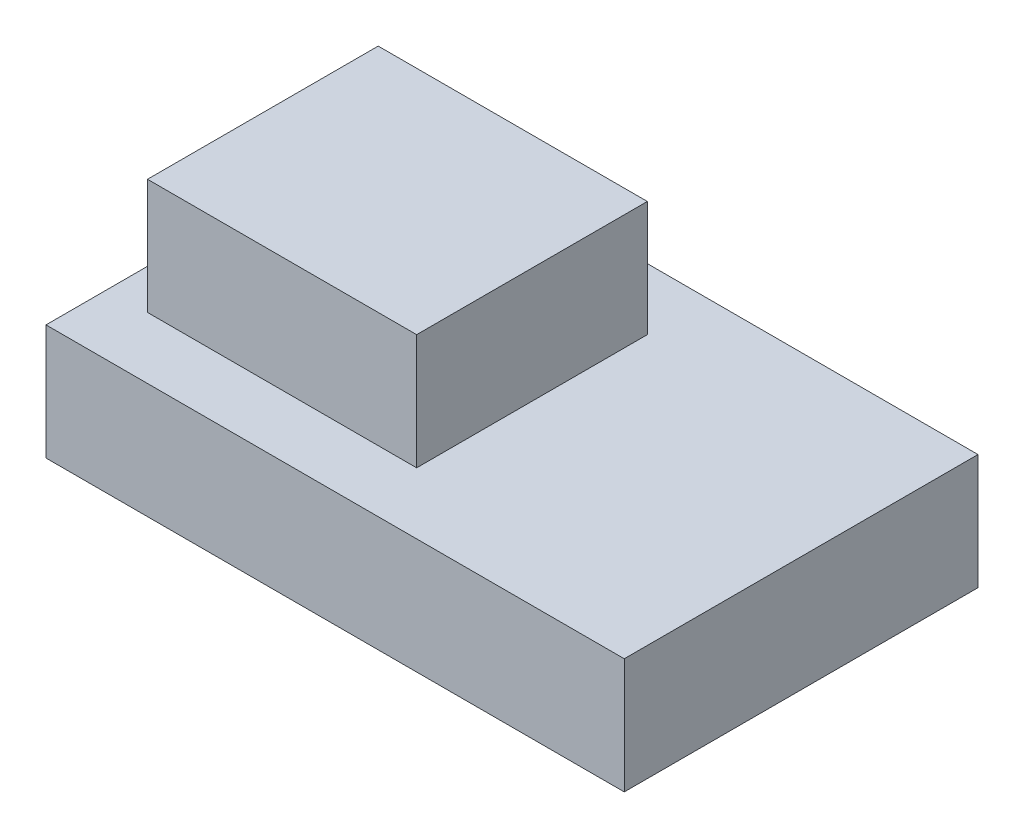
ISO-10303-21;
HEADER;
FILE_DESCRIPTION(('STEP AP214'),'2;1');
FILE_NAME('part.step','',(''),(''),'','','');
FILE_SCHEMA(('AUTOMOTIVE_DESIGN { 1 0 10303 214 1 1 1 1 }'));
ENDSEC;
DATA;
#1=APPLICATION_CONTEXT('core data for automotive mechanical design processes');
#2=APPLICATION_PROTOCOL_DEFINITION('international standard','automotive_design',2000,#1);
#3=PRODUCT_CONTEXT('',#1,'mechanical');
#4=PRODUCT('Part','Part','',(#3));
#5=PRODUCT_RELATED_PRODUCT_CATEGORY('part','',(#4));
#6=PRODUCT_DEFINITION_FORMATION('','',#4);
#7=PRODUCT_DEFINITION_CONTEXT('part definition',#1,'design');
#8=PRODUCT_DEFINITION('design','',#6,#7);
#9=PRODUCT_DEFINITION_SHAPE('','',#8);
#10=(LENGTH_UNIT() NAMED_UNIT(*) SI_UNIT(.MILLI.,.METRE.));
#11=(NAMED_UNIT(*) PLANE_ANGLE_UNIT() SI_UNIT($,.RADIAN.));
#12=(NAMED_UNIT(*) SI_UNIT($,.STERADIAN.) SOLID_ANGLE_UNIT());
#13=UNCERTAINTY_MEASURE_WITH_UNIT(LENGTH_MEASURE(1.E-05),#10,'distance_accuracy_value','');
#14=(GEOMETRIC_REPRESENTATION_CONTEXT(3) GLOBAL_UNCERTAINTY_ASSIGNED_CONTEXT((#13)) GLOBAL_UNIT_ASSIGNED_CONTEXT((#10,
#11,#12)) REPRESENTATION_CONTEXT('',''));
#15=CARTESIAN_POINT('',(0.,0.,0.));
#16=DIRECTION('',(0.,0.,1.));
#17=DIRECTION('',(1.,0.,0.));
#18=AXIS2_PLACEMENT_3D('',#15,#16,#17);
#19=CARTESIAN_POINT('',(0.,19.05,0.));
#20=DIRECTION('',(0.,-1.,0.));
#21=DIRECTION('',(0.,0.,-1.));
#22=AXIS2_PLACEMENT_3D('',#19,#20,#21);
#23=PLANE('',#22);
#24=DIRECTION('',(0.,0.,-1.));
#25=VECTOR('',#24,1.);
#26=CARTESIAN_POINT('',(47.752,19.05,29.21));
#27=LINE('',#26,#25);
#28=CARTESIAN_POINT('',(47.752,19.05,29.21));
#29=VERTEX_POINT('',#28);
#30=CARTESIAN_POINT('',(47.752,19.05,-29.21));
#31=VERTEX_POINT('',#30);
#32=EDGE_CURVE('E128',#29,#31,#27,.T.);
#33=ORIENTED_EDGE('',*,*,#32,.T.);
#34=DIRECTION('',(-1.,0.,0.));
#35=VECTOR('',#34,1.);
#36=CARTESIAN_POINT('',(-47.752,19.05,-29.21));
#37=LINE('',#36,#35);
#38=CARTESIAN_POINT('',(-47.752,19.05,-29.21));
#39=VERTEX_POINT('',#38);
#40=EDGE_CURVE('E131',#31,#39,#37,.T.);
#41=ORIENTED_EDGE('',*,*,#40,.T.);
#42=DIRECTION('',(0.,0.,1.));
#43=VECTOR('',#42,1.);
#44=CARTESIAN_POINT('',(-47.752,19.05,29.21));
#45=LINE('',#44,#43);
#46=CARTESIAN_POINT('',(-47.752,19.05,29.21));
#47=VERTEX_POINT('',#46);
#48=EDGE_CURVE('E134',#39,#47,#45,.T.);
#49=ORIENTED_EDGE('',*,*,#48,.T.);
#50=DIRECTION('',(1.,0.,0.));
#51=VECTOR('',#50,1.);
#52=CARTESIAN_POINT('',(-47.752,19.05,29.21));
#53=LINE('',#52,#51);
#54=EDGE_CURVE('E136',#47,#29,#53,.T.);
#55=ORIENTED_EDGE('',*,*,#54,.T.);
#56=EDGE_LOOP('',(#33,#41,#49,#55));
#57=FACE_BOUND('',#56,.T.);
#58=DIRECTION('',(0.,0.,-1.));
#59=VECTOR('',#58,1.);
#60=CARTESIAN_POINT('',(3.30200000000002,19.05,19.05));
#61=LINE('',#60,#59);
#62=CARTESIAN_POINT('',(3.30200000000002,19.05,19.05));
#63=VERTEX_POINT('',#62);
#64=CARTESIAN_POINT('',(3.30200000000002,19.05,-19.05));
#65=VERTEX_POINT('',#64);
#66=EDGE_CURVE('E118',#63,#65,#61,.T.);
#67=ORIENTED_EDGE('',*,*,#66,.F.);
#68=DIRECTION('',(1.,0.,0.));
#69=VECTOR('',#68,1.);
#70=CARTESIAN_POINT('',(-41.148,19.05,19.05));
#71=LINE('',#70,#69);
#72=CARTESIAN_POINT('',(-41.148,19.05,19.05));
#73=VERTEX_POINT('',#72);
#74=EDGE_CURVE('E115',#73,#63,#71,.T.);
#75=ORIENTED_EDGE('',*,*,#74,.F.);
#76=DIRECTION('',(0.,0.,1.));
#77=VECTOR('',#76,1.);
#78=CARTESIAN_POINT('',(-41.148,19.05,19.05));
#79=LINE('',#78,#77);
#80=CARTESIAN_POINT('',(-41.148,19.05,-19.05));
#81=VERTEX_POINT('',#80);
#82=EDGE_CURVE('E53',#81,#73,#79,.T.);
#83=ORIENTED_EDGE('',*,*,#82,.F.);
#84=DIRECTION('',(-1.,0.,0.));
#85=VECTOR('',#84,1.);
#86=CARTESIAN_POINT('',(-41.148,19.05,-19.05));
#87=LINE('',#86,#85);
#88=EDGE_CURVE('E48',#65,#81,#87,.T.);
#89=ORIENTED_EDGE('',*,*,#88,.F.);
#90=EDGE_LOOP('',(#67,#75,#83,#89));
#91=FACE_BOUND('',#90,.T.);
#92=ADVANCED_FACE('F33',(#57,#91),#23,.F.);
#93=CARTESIAN_POINT('',(47.752,19.05,29.21));
#94=DIRECTION('',(-1.,0.,0.));
#95=DIRECTION('',(0.,0.,1.));
#96=AXIS2_PLACEMENT_3D('',#93,#94,#95);
#97=PLANE('',#96);
#98=DIRECTION('',(0.,0.,-1.));
#99=VECTOR('',#98,1.);
#100=CARTESIAN_POINT('',(47.752,0.,29.21));
#101=LINE('',#100,#99);
#102=CARTESIAN_POINT('',(47.752,0.,29.21));
#103=VERTEX_POINT('',#102);
#104=CARTESIAN_POINT('',(47.752,0.,-29.21));
#105=VERTEX_POINT('',#104);
#106=EDGE_CURVE('E119',#103,#105,#101,.T.);
#107=ORIENTED_EDGE('',*,*,#106,.T.);
#108=DIRECTION('',(0.,-1.,0.));
#109=VECTOR('',#108,1.);
#110=CARTESIAN_POINT('',(47.752,19.05,-29.21));
#111=LINE('',#110,#109);
#112=EDGE_CURVE('E11',#31,#105,#111,.T.);
#113=ORIENTED_EDGE('',*,*,#112,.F.);
#114=ORIENTED_EDGE('',*,*,#32,.F.);
#115=DIRECTION('',(0.,-1.,0.));
#116=VECTOR('',#115,1.);
#117=CARTESIAN_POINT('',(47.752,19.05,29.21));
#118=LINE('',#117,#116);
#119=EDGE_CURVE('E137',#29,#103,#118,.T.);
#120=ORIENTED_EDGE('',*,*,#119,.T.);
#121=EDGE_LOOP('',(#107,#113,#114,#120));
#122=FACE_BOUND('',#121,.T.);
#123=ADVANCED_FACE('F35',(#122),#97,.F.);
#124=CARTESIAN_POINT('',(-47.752,19.05,-29.21));
#125=DIRECTION('',(0.,0.,1.));
#126=DIRECTION('',(1.,0.,0.));
#127=AXIS2_PLACEMENT_3D('',#124,#125,#126);
#128=PLANE('',#127);
#129=DIRECTION('',(-1.,0.,0.));
#130=VECTOR('',#129,1.);
#131=CARTESIAN_POINT('',(-47.752,0.,-29.21));
#132=LINE('',#131,#130);
#133=CARTESIAN_POINT('',(-47.752,0.,-29.21));
#134=VERTEX_POINT('',#133);
#135=EDGE_CURVE('E122',#105,#134,#132,.T.);
#136=ORIENTED_EDGE('',*,*,#135,.T.);
#137=DIRECTION('',(0.,-1.,0.));
#138=VECTOR('',#137,1.);
#139=CARTESIAN_POINT('',(-47.752,19.05,-29.21));
#140=LINE('',#139,#138);
#141=EDGE_CURVE('E41',#39,#134,#140,.T.);
#142=ORIENTED_EDGE('',*,*,#141,.F.);
#143=ORIENTED_EDGE('',*,*,#40,.F.);
#144=ORIENTED_EDGE('',*,*,#112,.T.);
#145=EDGE_LOOP('',(#136,#142,#143,#144));
#146=FACE_BOUND('',#145,.T.);
#147=ADVANCED_FACE('F167',(#146),#128,.F.);
#148=CARTESIAN_POINT('',(-47.752,19.05,29.21));
#149=DIRECTION('',(1.,0.,0.));
#150=DIRECTION('',(0.,0.,-1.));
#151=AXIS2_PLACEMENT_3D('',#148,#149,#150);
#152=PLANE('',#151);
#153=DIRECTION('',(0.,0.,1.));
#154=VECTOR('',#153,1.);
#155=CARTESIAN_POINT('',(-47.752,0.,29.21));
#156=LINE('',#155,#154);
#157=CARTESIAN_POINT('',(-47.752,0.,29.21));
#158=VERTEX_POINT('',#157);
#159=EDGE_CURVE('E140',#134,#158,#156,.T.);
#160=ORIENTED_EDGE('',*,*,#159,.T.);
#161=DIRECTION('',(0.,-1.,0.));
#162=VECTOR('',#161,1.);
#163=CARTESIAN_POINT('',(-47.752,19.05,29.21));
#164=LINE('',#163,#162);
#165=EDGE_CURVE('E145',#47,#158,#164,.T.);
#166=ORIENTED_EDGE('',*,*,#165,.F.);
#167=ORIENTED_EDGE('',*,*,#48,.F.);
#168=ORIENTED_EDGE('',*,*,#141,.T.);
#169=EDGE_LOOP('',(#160,#166,#167,#168));
#170=FACE_BOUND('',#169,.T.);
#171=ADVANCED_FACE('F152',(#170),#152,.F.);
#172=CARTESIAN_POINT('',(-47.752,19.05,29.21));
#173=DIRECTION('',(0.,0.,-1.));
#174=DIRECTION('',(-1.,0.,0.));
#175=AXIS2_PLACEMENT_3D('',#172,#173,#174);
#176=PLANE('',#175);
#177=DIRECTION('',(1.,0.,0.));
#178=VECTOR('',#177,1.);
#179=CARTESIAN_POINT('',(-47.752,0.,29.21));
#180=LINE('',#179,#178);
#181=EDGE_CURVE('E132',#158,#103,#180,.T.);
#182=ORIENTED_EDGE('',*,*,#181,.T.);
#183=ORIENTED_EDGE('',*,*,#119,.F.);
#184=ORIENTED_EDGE('',*,*,#54,.F.);
#185=ORIENTED_EDGE('',*,*,#165,.T.);
#186=EDGE_LOOP('',(#182,#183,#184,#185));
#187=FACE_BOUND('',#186,.T.);
#188=ADVANCED_FACE('F161',(#187),#176,.F.);
#189=CARTESIAN_POINT('',(0.,0.,0.));
#190=DIRECTION('',(0.,-1.,0.));
#191=DIRECTION('',(0.,0.,-1.));
#192=AXIS2_PLACEMENT_3D('',#189,#190,#191);
#193=PLANE('',#192);
#194=ORIENTED_EDGE('',*,*,#106,.F.);
#195=ORIENTED_EDGE('',*,*,#181,.F.);
#196=ORIENTED_EDGE('',*,*,#159,.F.);
#197=ORIENTED_EDGE('',*,*,#135,.F.);
#198=EDGE_LOOP('',(#194,#195,#196,#197));
#199=FACE_BOUND('',#198,.T.);
#200=ADVANCED_FACE('F158',(#199),#193,.T.);
#201=CARTESIAN_POINT('',(3.30200000000002,38.1,19.05));
#202=DIRECTION('',(-1.,0.,0.));
#203=DIRECTION('',(0.,0.,1.));
#204=AXIS2_PLACEMENT_3D('',#201,#202,#203);
#205=PLANE('',#204);
#206=ORIENTED_EDGE('',*,*,#66,.T.);
#207=DIRECTION('',(0.,-1.,0.));
#208=VECTOR('',#207,1.);
#209=CARTESIAN_POINT('',(3.30200000000002,38.1,-19.05));
#210=LINE('',#209,#208);
#211=CARTESIAN_POINT('',(3.30200000000002,38.1,-19.05));
#212=VERTEX_POINT('',#211);
#213=EDGE_CURVE('E99',#212,#65,#210,.T.);
#214=ORIENTED_EDGE('',*,*,#213,.F.);
#215=DIRECTION('',(0.,0.,-1.));
#216=VECTOR('',#215,1.);
#217=CARTESIAN_POINT('',(3.30200000000002,38.1,19.05));
#218=LINE('',#217,#216);
#219=CARTESIAN_POINT('',(3.30200000000002,38.1,19.05));
#220=VERTEX_POINT('',#219);
#221=EDGE_CURVE('E106',#220,#212,#218,.T.);
#222=ORIENTED_EDGE('',*,*,#221,.F.);
#223=DIRECTION('',(0.,-1.,0.));
#224=VECTOR('',#223,1.);
#225=CARTESIAN_POINT('',(3.30200000000002,38.1,19.05));
#226=LINE('',#225,#224);
#227=EDGE_CURVE('E260',#220,#63,#226,.T.);
#228=ORIENTED_EDGE('',*,*,#227,.T.);
#229=EDGE_LOOP('',(#206,#214,#222,#228));
#230=FACE_BOUND('',#229,.T.);
#231=ADVANCED_FACE('F117',(#230),#205,.F.);
#232=CARTESIAN_POINT('',(-41.148,38.1,-19.05));
#233=DIRECTION('',(0.,0.,1.));
#234=DIRECTION('',(1.,0.,0.));
#235=AXIS2_PLACEMENT_3D('',#232,#233,#234);
#236=PLANE('',#235);
#237=ORIENTED_EDGE('',*,*,#88,.T.);
#238=DIRECTION('',(0.,-1.,0.));
#239=VECTOR('',#238,1.);
#240=CARTESIAN_POINT('',(-41.148,38.1,-19.05));
#241=LINE('',#240,#239);
#242=CARTESIAN_POINT('',(-41.148,38.1,-19.05));
#243=VERTEX_POINT('',#242);
#244=EDGE_CURVE('E102',#243,#81,#241,.T.);
#245=ORIENTED_EDGE('',*,*,#244,.F.);
#246=DIRECTION('',(-1.,0.,0.));
#247=VECTOR('',#246,1.);
#248=CARTESIAN_POINT('',(-41.148,38.1,-19.05));
#249=LINE('',#248,#247);
#250=EDGE_CURVE('E95',#212,#243,#249,.T.);
#251=ORIENTED_EDGE('',*,*,#250,.F.);
#252=ORIENTED_EDGE('',*,*,#213,.T.);
#253=EDGE_LOOP('',(#237,#245,#251,#252));
#254=FACE_BOUND('',#253,.T.);
#255=ADVANCED_FACE('F97',(#254),#236,.F.);
#256=CARTESIAN_POINT('',(-41.148,38.1,19.05));
#257=DIRECTION('',(1.,0.,0.));
#258=DIRECTION('',(0.,0.,-1.));
#259=AXIS2_PLACEMENT_3D('',#256,#257,#258);
#260=PLANE('',#259);
#261=ORIENTED_EDGE('',*,*,#82,.T.);
#262=DIRECTION('',(0.,-1.,0.));
#263=VECTOR('',#262,1.);
#264=CARTESIAN_POINT('',(-41.148,38.1,19.05));
#265=LINE('',#264,#263);
#266=CARTESIAN_POINT('',(-41.148,38.1,19.05));
#267=VERTEX_POINT('',#266);
#268=EDGE_CURVE('E124',#267,#73,#265,.T.);
#269=ORIENTED_EDGE('',*,*,#268,.F.);
#270=DIRECTION('',(0.,0.,1.));
#271=VECTOR('',#270,1.);
#272=CARTESIAN_POINT('',(-41.148,38.1,19.05));
#273=LINE('',#272,#271);
#274=EDGE_CURVE('E105',#243,#267,#273,.T.);
#275=ORIENTED_EDGE('',*,*,#274,.F.);
#276=ORIENTED_EDGE('',*,*,#244,.T.);
#277=EDGE_LOOP('',(#261,#269,#275,#276));
#278=FACE_BOUND('',#277,.T.);
#279=ADVANCED_FACE('F203',(#278),#260,.F.);
#280=CARTESIAN_POINT('',(-41.148,38.1,19.05));
#281=DIRECTION('',(0.,0.,-1.));
#282=DIRECTION('',(-1.,0.,0.));
#283=AXIS2_PLACEMENT_3D('',#280,#281,#282);
#284=PLANE('',#283);
#285=ORIENTED_EDGE('',*,*,#74,.T.);
#286=ORIENTED_EDGE('',*,*,#227,.F.);
#287=DIRECTION('',(1.,0.,0.));
#288=VECTOR('',#287,1.);
#289=CARTESIAN_POINT('',(-41.148,38.1,19.05));
#290=LINE('',#289,#288);
#291=EDGE_CURVE('E111',#267,#220,#290,.T.);
#292=ORIENTED_EDGE('',*,*,#291,.F.);
#293=ORIENTED_EDGE('',*,*,#268,.T.);
#294=EDGE_LOOP('',(#285,#286,#292,#293));
#295=FACE_BOUND('',#294,.T.);
#296=ADVANCED_FACE('F209',(#295),#284,.F.);
#297=CARTESIAN_POINT('',(0.,38.1,0.));
#298=DIRECTION('',(0.,-1.,0.));
#299=DIRECTION('',(0.,0.,-1.));
#300=AXIS2_PLACEMENT_3D('',#297,#298,#299);
#301=PLANE('',#300);
#302=ORIENTED_EDGE('',*,*,#221,.T.);
#303=ORIENTED_EDGE('',*,*,#250,.T.);
#304=ORIENTED_EDGE('',*,*,#274,.T.);
#305=ORIENTED_EDGE('',*,*,#291,.T.);
#306=EDGE_LOOP('',(#302,#303,#304,#305));
#307=FACE_BOUND('',#306,.T.);
#308=ADVANCED_FACE('F109',(#307),#301,.F.);
#309=CLOSED_SHELL('',(#92,#123,#147,#171,#188,#200,#231,#255,#279,#296,#308));
#310=MANIFOLD_SOLID_BREP('B2',#309);
#311=ADVANCED_BREP_SHAPE_REPRESENTATION('',(#18,#310),#14);
#312=SHAPE_DEFINITION_REPRESENTATION(#9,#311);
ENDSEC;
END-ISO-10303-21;
